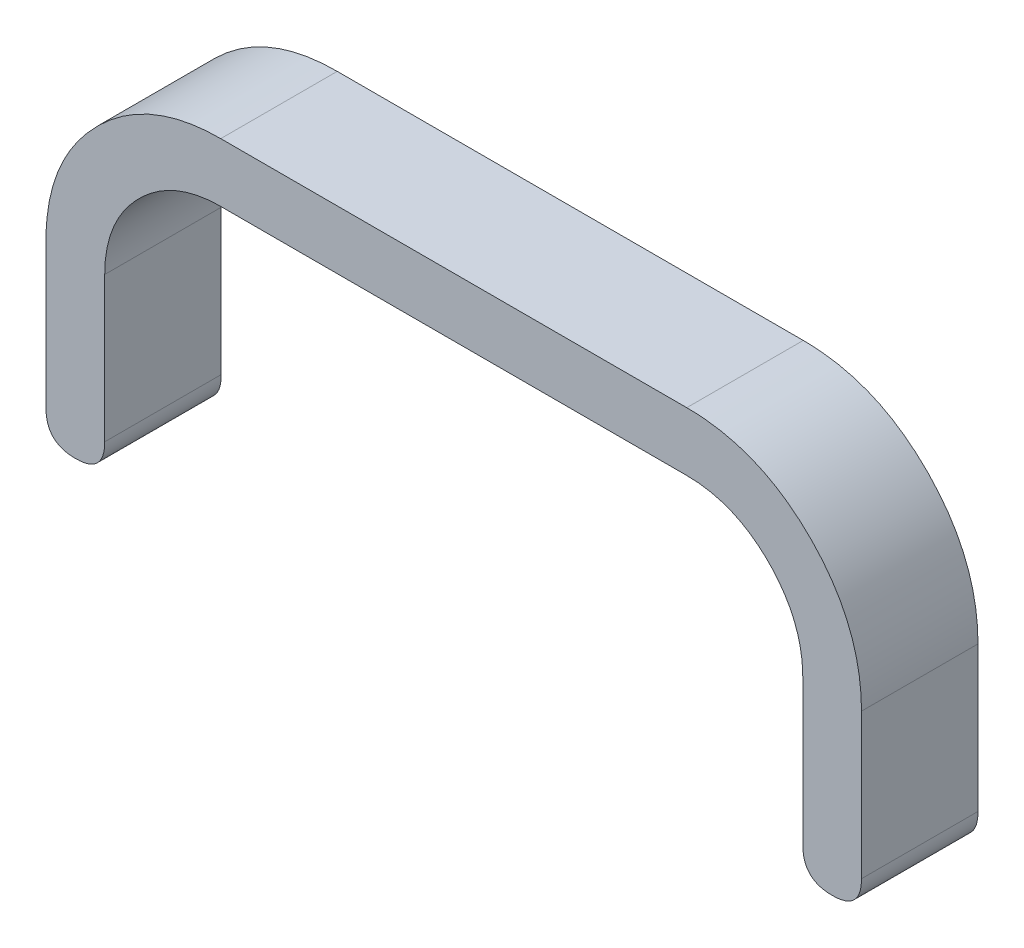
ISO-10303-21;
HEADER;
FILE_DESCRIPTION(('STEP AP214'),'2;1');
FILE_NAME('part.step','',(''),(''),'','','');
FILE_SCHEMA(('AUTOMOTIVE_DESIGN { 1 0 10303 214 1 1 1 1 }'));
ENDSEC;
DATA;
#1=APPLICATION_CONTEXT('core data for automotive mechanical design processes');
#2=APPLICATION_PROTOCOL_DEFINITION('international standard','automotive_design',2000,#1);
#3=PRODUCT_CONTEXT('',#1,'mechanical');
#4=PRODUCT('Part','Part','',(#3));
#5=PRODUCT_RELATED_PRODUCT_CATEGORY('part','',(#4));
#6=PRODUCT_DEFINITION_FORMATION('','',#4);
#7=PRODUCT_DEFINITION_CONTEXT('part definition',#1,'design');
#8=PRODUCT_DEFINITION('design','',#6,#7);
#9=PRODUCT_DEFINITION_SHAPE('','',#8);
#10=(LENGTH_UNIT() NAMED_UNIT(*) SI_UNIT(.MILLI.,.METRE.));
#11=(NAMED_UNIT(*) PLANE_ANGLE_UNIT() SI_UNIT($,.RADIAN.));
#12=(NAMED_UNIT(*) SI_UNIT($,.STERADIAN.) SOLID_ANGLE_UNIT());
#13=UNCERTAINTY_MEASURE_WITH_UNIT(LENGTH_MEASURE(1.E-05),#10,'distance_accuracy_value','');
#14=(GEOMETRIC_REPRESENTATION_CONTEXT(3) GLOBAL_UNCERTAINTY_ASSIGNED_CONTEXT((#13)) GLOBAL_UNIT_ASSIGNED_CONTEXT((#10,
#11,#12)) REPRESENTATION_CONTEXT('',''));
#15=CARTESIAN_POINT('',(0.,0.,0.));
#16=DIRECTION('',(0.,0.,1.));
#17=DIRECTION('',(1.,0.,0.));
#18=AXIS2_PLACEMENT_3D('',#15,#16,#17);
#19=CARTESIAN_POINT('',(0.,0.,0.));
#20=DIRECTION('',(0.,0.,1.));
#21=DIRECTION('',(1.,0.,0.));
#22=AXIS2_PLACEMENT_3D('',#19,#20,#21);
#23=PLANE('',#22);
#24=DIRECTION('',(0.,1.,0.));
#25=VECTOR('',#24,1.);
#26=CARTESIAN_POINT('',(2.7496,-20.3407175,0.));
#27=LINE('',#26,#25);
#28=CARTESIAN_POINT('',(2.7496,-20.4651075,0.));
#29=VERTEX_POINT('',#28);
#30=CARTESIAN_POINT('',(2.7496,-20.3407175,0.));
#31=VERTEX_POINT('',#30);
#32=EDGE_CURVE('E152',#29,#31,#27,.T.);
#33=ORIENTED_EDGE('',*,*,#32,.F.);
#34=CARTESIAN_POINT('',(2.7496,-20.4651075,0.));
#35=CARTESIAN_POINT('',(2.74960807870909,-20.467144578321,0.));
#36=CARTESIAN_POINT('',(2.74972821820761,-20.469212540125,0.));
#37=CARTESIAN_POINT('',(2.75035161883358,-20.4733290778557,0.));
#38=CARTESIAN_POINT('',(2.75086287535263,-20.4753763339155,0.));
#39=CARTESIAN_POINT('',(2.7524472053789,-20.4792910350747,0.));
#40=CARTESIAN_POINT('',(2.75352511881247,-20.4811567644396,0.));
#41=CARTESIAN_POINT('',(2.75629255072107,-20.4843845101896,0.));
#42=CARTESIAN_POINT('',(2.75798432078312,-20.4857446343754,0.));
#43=CARTESIAN_POINT('',(2.76210824248871,-20.4880848112958,0.));
#44=CARTESIAN_POINT('',(2.76462124834612,-20.488907254779,0.));
#45=CARTESIAN_POINT('',(2.76972255474357,-20.4898938254692,0.));
#46=CARTESIAN_POINT('',(2.77230750686315,-20.4900735730136,0.));
#47=CARTESIAN_POINT('',(2.7748,-20.49008,0.));
#48=B_SPLINE_CURVE_WITH_KNOTS('',3,(#34,#35,#36,#37,#38,#39,#40,#41,#42,#43,#44,#45,#46,#47),
.UNSPECIFIED.,.F.,.F.,(4,2,2,2,2,2,4),(0.,0.00615741816168192,0.0124441880141881,
0.0187855483379579,0.0251504074660603,0.0329680336586619,0.0405943144542345),.UNSPECIFIED.);
#49=CARTESIAN_POINT('',(2.7748,-20.49008,0.));
#50=VERTEX_POINT('',#49);
#51=EDGE_CURVE('E269',#29,#50,#48,.T.);
#52=ORIENTED_EDGE('',*,*,#51,.T.);
#53=CARTESIAN_POINT('',(2.7748,-20.49008,0.));
#54=CARTESIAN_POINT('',(2.77689249082312,-20.4900711009627,0.));
#55=CARTESIAN_POINT('',(2.77901882228493,-20.489948007743,0.));
#56=CARTESIAN_POINT('',(2.78325225684113,-20.4893034042043,0.));
#57=CARTESIAN_POINT('',(2.78535791549197,-20.4887732152388,0.));
#58=CARTESIAN_POINT('',(2.78932411457904,-20.487144557943,0.));
#59=CARTESIAN_POINT('',(2.79118832601554,-20.4860562870533,0.));
#60=CARTESIAN_POINT('',(2.79440959926015,-20.4832687806146,0.));
#61=CARTESIAN_POINT('',(2.79576470062887,-20.4815672317718,0.));
#62=CARTESIAN_POINT('',(2.79808127374799,-20.4774330822669,0.));
#63=CARTESIAN_POINT('',(2.79888813295651,-20.474922058413,0.));
#64=CARTESIAN_POINT('',(2.79982499708085,-20.46993196635,0.));
#65=CARTESIAN_POINT('',(2.799994845539,-20.4674610524802,0.));
#66=CARTESIAN_POINT('',(2.8,-20.4650725,0.));
#67=B_SPLINE_CURVE_WITH_KNOTS('',3,(#53,#54,#55,#56,#57,#58,#59,#60,#61,#62,#63,#64,#65,#66),
.UNSPECIFIED.,.F.,.F.,(4,2,2,2,2,2,4),(0.,0.00632865589769137,0.0127961082036602,
0.019149386352187,0.0255268843609778,0.0333230170829302,0.0406225102328526),.UNSPECIFIED.);
#68=CARTESIAN_POINT('',(2.8,-20.4650725,0.));
#69=VERTEX_POINT('',#68);
#70=EDGE_CURVE('E262',#50,#69,#67,.T.);
#71=ORIENTED_EDGE('',*,*,#70,.T.);
#72=DIRECTION('',(0.,1.,0.));
#73=VECTOR('',#72,1.);
#74=CARTESIAN_POINT('',(2.8,-20.4650725,0.));
#75=LINE('',#74,#73);
#76=CARTESIAN_POINT('',(2.8,-20.3405075,0.));
#77=VERTEX_POINT('',#76);
#78=EDGE_CURVE('E123',#77,#69,#75,.F.);
#79=ORIENTED_EDGE('',*,*,#78,.F.);
#80=CARTESIAN_POINT('',(2.8,-20.3405075,0.));
#81=CARTESIAN_POINT('',(2.80002347245347,-20.3320217202953,0.));
#82=CARTESIAN_POINT('',(2.79939850743918,-20.3235098149267,0.));
#83=CARTESIAN_POINT('',(2.79676662552694,-20.3067536514176,0.));
#84=CARTESIAN_POINT('',(2.7947672254067,-20.2985081916382,0.));
#85=CARTESIAN_POINT('',(2.78921797084564,-20.2822560136484,0.));
#86=CARTESIAN_POINT('',(2.78562147952115,-20.2742648812623,0.));
#87=CARTESIAN_POINT('',(2.7770112790827,-20.2590803276584,0.));
#88=CARTESIAN_POINT('',(2.7719952070086,-20.2518882645637,0.));
#89=CARTESIAN_POINT('',(2.76127873269534,-20.2389063600848,0.));
#90=CARTESIAN_POINT('',(2.75565430063458,-20.2330526633238,0.));
#91=CARTESIAN_POINT('',(2.74362209917352,-20.2222199581196,0.));
#92=CARTESIAN_POINT('',(2.73721520118955,-20.2172399914185,0.));
#93=CARTESIAN_POINT('',(2.72285146449312,-20.2079200467368,0.));
#94=CARTESIAN_POINT('',(2.7148010398298,-20.2037214329533,0.));
#95=CARTESIAN_POINT('',(2.69802894082252,-20.1969874171256,0.));
#96=CARTESIAN_POINT('',(2.68930706083362,-20.1944525269083,0.));
#97=CARTESIAN_POINT('',(2.6754216870949,-20.1917705993874,0.));
#98=CARTESIAN_POINT('',(2.67035671800322,-20.1910646935576,0.));
#99=CARTESIAN_POINT('',(2.66019643313504,-20.1901397964624,0.));
#100=CARTESIAN_POINT('',(2.65510124584216,-20.1899194162579,0.));
#101=CARTESIAN_POINT('',(2.6500075,-20.18992,0.));
#102=B_SPLINE_CURVE_WITH_KNOTS('',3,(#80,#81,#82,#83,#84,#85,#86,#87,#88,#89,#90,#91,#92,#93,
#94,#95,#96,#97,#98,#99,#100,#101),.UNSPECIFIED.,.F.,.F.,(4,2,2,2,2,2,2,2,2,2,4),(0.,
0.0254711021853363,0.0508039998777647,0.0769309985183244,0.103101745206667,0.127375288651194,
0.151622041523846,0.17868297156612,0.205752222717763,0.221073109481131,0.236350110687773),.UNSPECIFIED.);
#103=CARTESIAN_POINT('',(2.6500075,-20.18992,0.));
#104=VERTEX_POINT('',#103);
#105=EDGE_CURVE('E24',#77,#104,#102,.T.);
#106=ORIENTED_EDGE('',*,*,#105,.T.);
#107=DIRECTION('',(1.,0.,0.));
#108=VECTOR('',#107,1.);
#109=CARTESIAN_POINT('',(2.6500075,-20.18992,0.));
#110=LINE('',#109,#108);
#111=CARTESIAN_POINT('',(2.2499925,-20.18992,0.));
#112=VERTEX_POINT('',#111);
#113=EDGE_CURVE('E128',#112,#104,#110,.T.);
#114=ORIENTED_EDGE('',*,*,#113,.F.);
#115=CARTESIAN_POINT('',(2.2499925,-20.18992,0.));
#116=CARTESIAN_POINT('',(2.24150404708559,-20.189895741139,0.));
#117=CARTESIAN_POINT('',(2.23298836338036,-20.1905265430491,0.));
#118=CARTESIAN_POINT('',(2.21623002439109,-20.1931844162875,0.));
#119=CARTESIAN_POINT('',(2.20798612080651,-20.195203755814,0.));
#120=CARTESIAN_POINT('',(2.19183005145181,-20.2007808490056,0.));
#121=CARTESIAN_POINT('',(2.18392856942392,-20.2043701936911,0.));
#122=CARTESIAN_POINT('',(2.16892087909701,-20.2129485100859,0.));
#123=CARTESIAN_POINT('',(2.1618159079179,-20.2179396179648,0.));
#124=CARTESIAN_POINT('',(2.14900245858002,-20.2285937167868,0.));
#125=CARTESIAN_POINT('',(2.14322990451648,-20.2341810848491,0.));
#126=CARTESIAN_POINT('',(2.1325341600748,-20.2461138985911,0.));
#127=CARTESIAN_POINT('',(2.12761023904276,-20.2524586841028,0.));
#128=CARTESIAN_POINT('',(2.11829685247503,-20.2667768579616,0.));
#129=CARTESIAN_POINT('',(2.11406458301313,-20.274854647397,0.));
#130=CARTESIAN_POINT('',(2.10725964115796,-20.2916838471437,0.));
#131=CARTESIAN_POINT('',(2.10468729813588,-20.3004353907595,0.));
#132=CARTESIAN_POINT('',(2.10192824866457,-20.3144728455269,0.));
#133=CARTESIAN_POINT('',(2.10119274214425,-20.3196598899884,0.));
#134=CARTESIAN_POINT('',(2.10022890363213,-20.3300677834004,0.));
#135=CARTESIAN_POINT('',(2.09999923338375,-20.3352885064149,0.));
#136=CARTESIAN_POINT('',(2.1,-20.3405075,0.));
#137=B_SPLINE_CURVE_WITH_KNOTS('',3,(#115,#116,#117,#118,#119,#120,#121,#122,#123,#124,#125,
#126,#127,#128,#129,#130,#131,#132,#133,#134,#135,#136),.UNSPECIFIED.,.F.,.F.,(4,2,2,2,2,2,2,2,
2,2,4),(0.,0.0254804082047982,0.0508200706054709,0.0766949145066699,0.10260940547549,
0.126632549326425,0.150634905330637,0.177816726912359,0.205003940394527,0.220698393364785,
0.236351274459153),.UNSPECIFIED.);
#138=CARTESIAN_POINT('',(2.1,-20.3405075,0.));
#139=VERTEX_POINT('',#138);
#140=EDGE_CURVE('E146',#112,#139,#137,.T.);
#141=ORIENTED_EDGE('',*,*,#140,.T.);
#142=DIRECTION('',(0.,1.,0.));
#143=VECTOR('',#142,1.);
#144=CARTESIAN_POINT('',(2.1,-20.3405075,0.));
#145=LINE('',#144,#143);
#146=CARTESIAN_POINT('',(2.1,-20.4650725,0.));
#147=VERTEX_POINT('',#146);
#148=EDGE_CURVE('E164',#147,#139,#145,.T.);
#149=ORIENTED_EDGE('',*,*,#148,.F.);
#150=CARTESIAN_POINT('',(2.1,-20.4650725,0.));
#151=CARTESIAN_POINT('',(2.10000814940635,-20.4671154799164,0.));
#152=CARTESIAN_POINT('',(2.10012861312222,-20.4691896005673,0.));
#153=CARTESIAN_POINT('',(2.10075416525257,-20.4733184530926,0.));
#154=CARTESIAN_POINT('',(2.10126730910898,-20.4753718542771,0.));
#155=CARTESIAN_POINT('',(2.10285631262184,-20.4792933800596,0.));
#156=CARTESIAN_POINT('',(2.10393579033859,-20.4811602204295,0.));
#157=CARTESIAN_POINT('',(2.10670670524853,-20.4843895734181,0.));
#158=CARTESIAN_POINT('',(2.10840040081975,-20.4857501868259,0.));
#159=CARTESIAN_POINT('',(2.11252786982429,-20.4880899416791,0.));
#160=CARTESIAN_POINT('',(2.11504234385639,-20.4889116265335,0.));
#161=CARTESIAN_POINT('',(2.12013761228872,-20.4898946450458,0.));
#162=CARTESIAN_POINT('',(2.12271462573813,-20.4900736834129,0.));
#163=CARTESIAN_POINT('',(2.1252,-20.49008,0.));
#164=B_SPLINE_CURVE_WITH_KNOTS('',3,(#150,#151,#152,#153,#154,#155,#156,#157,#158,#159,#160,
#161,#162,#163),.UNSPECIFIED.,.F.,.F.,(4,2,2,2,2,2,4),(0.,0.00617555295361225,
0.0124813041899314,0.018827839685845,0.0251979509500648,0.0330188630002424,0.040622583008629),.UNSPECIFIED.);
#165=CARTESIAN_POINT('',(2.1252,-20.49008,0.));
#166=VERTEX_POINT('',#165);
#167=EDGE_CURVE('E250',#147,#166,#164,.T.);
#168=ORIENTED_EDGE('',*,*,#167,.T.);
#169=CARTESIAN_POINT('',(2.1252,-20.49008,0.));
#170=CARTESIAN_POINT('',(2.12729559112084,-20.4900710352382,0.));
#171=CARTESIAN_POINT('',(2.12942525688445,-20.4899477882629,0.));
#172=CARTESIAN_POINT('',(2.13366539232826,-20.4893018722382,0.));
#173=CARTESIAN_POINT('',(2.13577440768665,-20.4887704711943,0.));
#174=CARTESIAN_POINT('',(2.13974190435177,-20.4871392765701,0.));
#175=CARTESIAN_POINT('',(2.14160452667354,-20.4860509711266,0.));
#176=CARTESIAN_POINT('',(2.14482272322683,-20.4832639308902,0.));
#177=CARTESIAN_POINT('',(2.14617633290092,-20.4815628796141,0.));
#178=CARTESIAN_POINT('',(2.14848911306052,-20.4774310621813,0.));
#179=CARTESIAN_POINT('',(2.14929403520258,-20.474922133203,0.));
#180=CARTESIAN_POINT('',(2.15022605950084,-20.4699451267066,0.));
#181=CARTESIAN_POINT('',(2.15039494677754,-20.4674855666812,0.));
#182=CARTESIAN_POINT('',(2.1504,-20.4651075,0.));
#183=B_SPLINE_CURVE_WITH_KNOTS('',3,(#169,#170,#171,#172,#173,#174,#175,#176,#177,#178,#179,
#180,#181,#182),.UNSPECIFIED.,.F.,.F.,(4,2,2,2,2,2,4),(0.,0.00633835841973599,0.01281623087059,
0.0191655597386061,0.0255391485675933,0.0333274919146962,0.0405942283673216),.UNSPECIFIED.);
#184=CARTESIAN_POINT('',(2.1504,-20.4651075,0.));
#185=VERTEX_POINT('',#184);
#186=EDGE_CURVE('E163',#166,#185,#183,.T.);
#187=ORIENTED_EDGE('',*,*,#186,.T.);
#188=DIRECTION('',(0.,1.,0.));
#189=VECTOR('',#188,1.);
#190=CARTESIAN_POINT('',(2.1504,-20.4651075,0.));
#191=LINE('',#190,#189);
#192=CARTESIAN_POINT('',(2.1504,-20.3407175,0.));
#193=VERTEX_POINT('',#192);
#194=EDGE_CURVE('E160',#193,#185,#191,.F.);
#195=ORIENTED_EDGE('',*,*,#194,.F.);
#196=CARTESIAN_POINT('',(2.1504,-20.3407175,0.));
#197=CARTESIAN_POINT('',(2.15038419090499,-20.3351146994841,0.));
#198=CARTESIAN_POINT('',(2.15079840304606,-20.3294955033454,0.));
#199=CARTESIAN_POINT('',(2.15253650003459,-20.3184349901666,0.));
#200=CARTESIAN_POINT('',(2.15385516055024,-20.3129928385838,0.));
#201=CARTESIAN_POINT('',(2.15746110040773,-20.3023973418052,0.));
#202=CARTESIAN_POINT('',(2.15975410555372,-20.2972459110897,0.));
#203=CARTESIAN_POINT('',(2.16522169443857,-20.2874294081864,0.));
#204=CARTESIAN_POINT('',(2.16839775696199,-20.2827651700437,0.));
#205=CARTESIAN_POINT('',(2.1753001194857,-20.2741682393562,0.));
#206=CARTESIAN_POINT('',(2.17900021947354,-20.2702141524113,0.));
#207=CARTESIAN_POINT('',(2.18692060688149,-20.2628689266225,0.));
#208=CARTESIAN_POINT('',(2.19114047881192,-20.2594773431549,0.));
#209=CARTESIAN_POINT('',(2.20067631088905,-20.2530544121251,0.));
#210=CARTESIAN_POINT('',(2.20606344541421,-20.2501263604449,0.));
#211=CARTESIAN_POINT('',(2.21731554925429,-20.2454059380596,0.));
#212=CARTESIAN_POINT('',(2.22318050756016,-20.2436135411974,0.));
#213=CARTESIAN_POINT('',(2.23262924341519,-20.2416794594875,0.));
#214=CARTESIAN_POINT('',(2.23614212948037,-20.2411609706121,0.));
#215=CARTESIAN_POINT('',(2.243194687602,-20.2404813077041,0.));
#216=CARTESIAN_POINT('',(2.24673427935522,-20.2403193136625,0.));
#217=CARTESIAN_POINT('',(2.2502725,-20.24032,0.));
#218=B_SPLINE_CURVE_WITH_KNOTS('',3,(#196,#197,#198,#199,#200,#201,#202,#203,#204,#205,#206,
#207,#208,#209,#210,#211,#212,#213,#214,#215,#216,#217),.UNSPECIFIED.,.F.,.F.,(4,2,2,2,2,2,2,2,
2,2,4),(0.,0.0168161592715581,0.0335359930770567,0.0503554714223923,0.0672032874124351,
0.0833959404834371,0.0995757326428344,0.117847771018597,0.136119388526332,0.146755727970553,
0.157367576036084),.UNSPECIFIED.);
#219=CARTESIAN_POINT('',(2.2502725,-20.24032,0.));
#220=VERTEX_POINT('',#219);
#221=EDGE_CURVE('E159',#193,#220,#218,.T.);
#222=ORIENTED_EDGE('',*,*,#221,.T.);
#223=DIRECTION('',(1.,0.,0.));
#224=VECTOR('',#223,1.);
#225=CARTESIAN_POINT('',(2.2502725,-20.24032,0.));
#226=LINE('',#225,#224);
#227=CARTESIAN_POINT('',(2.6497275,-20.24032,0.));
#228=VERTEX_POINT('',#227);
#229=EDGE_CURVE('E156',#228,#220,#226,.F.);
#230=ORIENTED_EDGE('',*,*,#229,.F.);
#231=CARTESIAN_POINT('',(2.6497275,-20.24032,0.));
#232=CARTESIAN_POINT('',(2.65525632027436,-20.2403047276785,0.));
#233=CARTESIAN_POINT('',(2.66080181263927,-20.2407115069295,0.));
#234=CARTESIAN_POINT('',(2.6717203535863,-20.2424212128108,0.));
#235=CARTESIAN_POINT('',(2.67709416016376,-20.2437193798898,0.));
#236=CARTESIAN_POINT('',(2.68755767553323,-20.2472733819885,0.));
#237=CARTESIAN_POINT('',(2.69264545124568,-20.2495350108111,0.));
#238=CARTESIAN_POINT('',(2.70233877312393,-20.2549301187693,0.));
#239=CARTESIAN_POINT('',(2.70694366316865,-20.2580647635164,0.));
#240=CARTESIAN_POINT('',(2.71540885654263,-20.2648721989559,0.));
#241=CARTESIAN_POINT('',(2.71929244055137,-20.268516562587,0.));
#242=CARTESIAN_POINT('',(2.72652467534636,-20.2763016063643,0.));
#243=CARTESIAN_POINT('',(2.72987350510711,-20.2804421196408,0.));
#244=CARTESIAN_POINT('',(2.7363277110403,-20.2898954208589,0.));
#245=CARTESIAN_POINT('',(2.73931543366999,-20.2952904815276,0.));
#246=CARTESIAN_POINT('',(2.7441624001479,-20.3065658723933,0.));
#247=CARTESIAN_POINT('',(2.74602196852189,-20.3124460624842,0.));
#248=CARTESIAN_POINT('',(2.74809652195806,-20.3221009435302,0.));
#249=CARTESIAN_POINT('',(2.74866991236434,-20.3258041989531,0.));
#250=CARTESIAN_POINT('',(2.74942188095505,-20.3332448391632,0.));
#251=CARTESIAN_POINT('',(2.74960113070034,-20.3369821549859,0.));
#252=CARTESIAN_POINT('',(2.7496,-20.3407175,0.));
#253=B_SPLINE_CURVE_WITH_KNOTS('',3,(#231,#232,#233,#234,#235,#236,#237,#238,#239,#240,#241,
#242,#243,#244,#245,#246,#247,#248,#249,#250,#251,#252),.UNSPECIFIED.,.F.,.F.,(4,2,2,2,2,2,2,2,
2,2,4),(0.,0.0165951248365384,0.0331023223477367,0.049710219604979,0.0663403981674403,
0.0822659881261889,0.0981862367986119,0.116567440984085,0.134943355107242,0.14616599304673,
0.157369494306616),.UNSPECIFIED.);
#254=EDGE_CURVE('E155',#228,#31,#253,.T.);
#255=ORIENTED_EDGE('',*,*,#254,.T.);
#256=EDGE_LOOP('',(#33,#52,#71,#79,#106,#114,#141,#149,#168,#187,#195,#222,#230,#255));
#257=FACE_BOUND('',#256,.T.);
#258=ADVANCED_FACE('F17',(#257),#23,.T.);
#259=CARTESIAN_POINT('',(2.8,-20.4650725,-0.1));
#260=DIRECTION('',(1.,0.,0.));
#261=DIRECTION('',(0.,0.,-1.));
#262=AXIS2_PLACEMENT_3D('',#259,#260,#261);
#263=PLANE('',#262);
#264=DIRECTION('',(0.,1.,0.));
#265=VECTOR('',#264,1.);
#266=CARTESIAN_POINT('',(2.8,0.,-0.1));
#267=LINE('',#266,#265);
#268=CARTESIAN_POINT('',(2.8,-20.4650725,-0.1));
#269=VERTEX_POINT('',#268);
#270=CARTESIAN_POINT('',(2.8,-20.3405075,-0.1));
#271=VERTEX_POINT('',#270);
#272=EDGE_CURVE('E369',#269,#271,#267,.T.);
#273=ORIENTED_EDGE('',*,*,#272,.T.);
#274=DIRECTION('',(0.,0.,1.));
#275=VECTOR('',#274,1.);
#276=CARTESIAN_POINT('',(2.8,-20.3405075,-0.05));
#277=LINE('',#276,#275);
#278=EDGE_CURVE('E140',#271,#77,#277,.T.);
#279=ORIENTED_EDGE('',*,*,#278,.T.);
#280=ORIENTED_EDGE('',*,*,#78,.T.);
#281=DIRECTION('',(0.,0.,-1.));
#282=VECTOR('',#281,1.);
#283=CARTESIAN_POINT('',(2.8,-20.4650725,-0.05));
#284=LINE('',#283,#282);
#285=EDGE_CURVE('E372',#69,#269,#284,.T.);
#286=ORIENTED_EDGE('',*,*,#285,.T.);
#287=EDGE_LOOP('',(#273,#279,#280,#286));
#288=FACE_BOUND('',#287,.T.);
#289=ADVANCED_FACE('F258',(#288),#263,.T.);
#290=CARTESIAN_POINT('',(2.8,-20.3405075,-0.1));
#291=CARTESIAN_POINT('',(2.8,-20.2779625,-0.1));
#292=CARTESIAN_POINT('',(2.7125,-20.18992,-0.1));
#293=CARTESIAN_POINT('',(2.6500075,-20.18992,-0.1));
#294=CARTESIAN_POINT('',(2.8,-20.3405075,0.));
#295=CARTESIAN_POINT('',(2.8,-20.2779625,0.));
#296=CARTESIAN_POINT('',(2.7125,-20.18992,0.));
#297=CARTESIAN_POINT('',(2.6500075,-20.18992,0.));
#298=B_SPLINE_SURFACE_WITH_KNOTS('',1,2,((#290,#291,#292,#293),(#294,#295,#296,#297)),
.UNSPECIFIED.,.F.,.F.,.F.,(2,2),(3,1,3),(0.,1.),(0.,0.5,1.),.UNSPECIFIED.);
#299=CARTESIAN_POINT('',(2.8,-20.3405075,-0.1));
#300=CARTESIAN_POINT('',(2.80002347245347,-20.3320217202953,-0.1));
#301=CARTESIAN_POINT('',(2.79939850743918,-20.3235098149267,-0.1));
#302=CARTESIAN_POINT('',(2.79676662552694,-20.3067536514176,-0.1));
#303=CARTESIAN_POINT('',(2.7947672254067,-20.2985081916382,-0.1));
#304=CARTESIAN_POINT('',(2.78921797084564,-20.2822560136484,-0.1));
#305=CARTESIAN_POINT('',(2.78562147952115,-20.2742648812623,-0.1));
#306=CARTESIAN_POINT('',(2.7770112790827,-20.2590803276584,-0.1));
#307=CARTESIAN_POINT('',(2.7719952070086,-20.2518882645637,-0.1));
#308=CARTESIAN_POINT('',(2.76127873269534,-20.2389063600848,-0.1));
#309=CARTESIAN_POINT('',(2.75565430063458,-20.2330526633238,-0.1));
#310=CARTESIAN_POINT('',(2.74362209917352,-20.2222199581196,-0.1));
#311=CARTESIAN_POINT('',(2.73721520118955,-20.2172399914185,-0.1));
#312=CARTESIAN_POINT('',(2.72285146449312,-20.2079200467368,-0.1));
#313=CARTESIAN_POINT('',(2.7148010398298,-20.2037214329533,-0.1));
#314=CARTESIAN_POINT('',(2.69802894082252,-20.1969874171256,-0.1));
#315=CARTESIAN_POINT('',(2.68930706083362,-20.1944525269083,-0.1));
#316=CARTESIAN_POINT('',(2.6754216870949,-20.1917705993874,-0.1));
#317=CARTESIAN_POINT('',(2.67035671800322,-20.1910646935576,-0.1));
#318=CARTESIAN_POINT('',(2.66019643313504,-20.1901397964624,-0.1));
#319=CARTESIAN_POINT('',(2.65510124584216,-20.1899194162579,-0.1));
#320=CARTESIAN_POINT('',(2.6500075,-20.18992,-0.1));
#321=B_SPLINE_CURVE_WITH_KNOTS('',3,(#299,#300,#301,#302,#303,#304,#305,#306,#307,#308,#309,
#310,#311,#312,#313,#314,#315,#316,#317,#318,#319,#320),.UNSPECIFIED.,.F.,.F.,(4,2,2,2,2,2,2,2,
2,2,4),(0.,0.0254711021853363,0.0508039998777646,0.0769309985183242,0.103101745206667,
0.127375288651194,0.151622041523846,0.178682971566121,0.205752222717764,0.221073109481131,
0.236350110687773),.UNSPECIFIED.);
#322=CARTESIAN_POINT('',(2.6500075,-20.18992,-0.1));
#323=VERTEX_POINT('',#322);
#324=EDGE_CURVE('E144',#271,#323,#321,.T.);
#325=DIRECTION('',(0.,0.,1.));
#326=VECTOR('',#325,1.);
#327=CARTESIAN_POINT('',(2.6500075,-20.18992,-0.1));
#328=LINE('',#327,#326);
#329=EDGE_CURVE('E132',#104,#323,#328,.F.);
#330=ORIENTED_EDGE('',*,*,#278,.F.);
#331=ORIENTED_EDGE('',*,*,#324,.T.);
#332=ORIENTED_EDGE('',*,*,#329,.F.);
#333=ORIENTED_EDGE('',*,*,#105,.F.);
#334=EDGE_LOOP('',(#330,#331,#332,#333));
#335=FACE_BOUND('',#334,.T.);
#336=ADVANCED_FACE('F142',(#335),#298,.F.);
#337=CARTESIAN_POINT('',(2.6500075,-20.18992,-0.1));
#338=DIRECTION('',(0.,1.,0.));
#339=DIRECTION('',(0.,0.,1.));
#340=AXIS2_PLACEMENT_3D('',#337,#338,#339);
#341=PLANE('',#340);
#342=DIRECTION('',(1.,0.,0.));
#343=VECTOR('',#342,1.);
#344=CARTESIAN_POINT('',(0.,-20.18992,-0.1));
#345=LINE('',#344,#343);
#346=CARTESIAN_POINT('',(2.2499925,-20.18992,-0.1));
#347=VERTEX_POINT('',#346);
#348=EDGE_CURVE('E221',#323,#347,#345,.F.);
#349=ORIENTED_EDGE('',*,*,#348,.T.);
#350=DIRECTION('',(0.,0.,1.));
#351=VECTOR('',#350,1.);
#352=CARTESIAN_POINT('',(2.2499925,-20.18992,-0.05));
#353=LINE('',#352,#351);
#354=EDGE_CURVE('E134',#347,#112,#353,.T.);
#355=ORIENTED_EDGE('',*,*,#354,.T.);
#356=ORIENTED_EDGE('',*,*,#113,.T.);
#357=ORIENTED_EDGE('',*,*,#329,.T.);
#358=EDGE_LOOP('',(#349,#355,#356,#357));
#359=FACE_BOUND('',#358,.T.);
#360=ADVANCED_FACE('F130',(#359),#341,.T.);
#361=CARTESIAN_POINT('',(2.2499925,-20.18992,-0.1));
#362=CARTESIAN_POINT('',(2.1875,-20.18992,-0.1));
#363=CARTESIAN_POINT('',(2.1,-20.2779625,-0.1));
#364=CARTESIAN_POINT('',(2.1,-20.3405075,-0.1));
#365=CARTESIAN_POINT('',(2.2499925,-20.18992,0.));
#366=CARTESIAN_POINT('',(2.1875,-20.18992,0.));
#367=CARTESIAN_POINT('',(2.1,-20.2779625,0.));
#368=CARTESIAN_POINT('',(2.1,-20.3405075,0.));
#369=B_SPLINE_SURFACE_WITH_KNOTS('',1,2,((#361,#362,#363,#364),(#365,#366,#367,#368)),
.UNSPECIFIED.,.F.,.F.,.F.,(2,2),(3,1,3),(0.,1.),(0.,0.5,1.),.UNSPECIFIED.);
#370=CARTESIAN_POINT('',(2.2499925,-20.18992,-0.1));
#371=CARTESIAN_POINT('',(2.24150404708559,-20.189895741139,-0.1));
#372=CARTESIAN_POINT('',(2.23298836338036,-20.1905265430491,-0.1));
#373=CARTESIAN_POINT('',(2.21623002439109,-20.1931844162875,-0.1));
#374=CARTESIAN_POINT('',(2.20798612080651,-20.195203755814,-0.1));
#375=CARTESIAN_POINT('',(2.19183005145181,-20.2007808490056,-0.1));
#376=CARTESIAN_POINT('',(2.18392856942392,-20.2043701936911,-0.1));
#377=CARTESIAN_POINT('',(2.16892087909701,-20.2129485100859,-0.1));
#378=CARTESIAN_POINT('',(2.1618159079179,-20.2179396179648,-0.1));
#379=CARTESIAN_POINT('',(2.14900245858002,-20.2285937167868,-0.1));
#380=CARTESIAN_POINT('',(2.14322990451647,-20.2341810848491,-0.1));
#381=CARTESIAN_POINT('',(2.1325341600748,-20.2461138985911,-0.1));
#382=CARTESIAN_POINT('',(2.12761023904276,-20.2524586841028,-0.1));
#383=CARTESIAN_POINT('',(2.11829685247503,-20.2667768579616,-0.1));
#384=CARTESIAN_POINT('',(2.11406458301313,-20.274854647397,-0.1));
#385=CARTESIAN_POINT('',(2.10725964115796,-20.2916838471437,-0.1));
#386=CARTESIAN_POINT('',(2.10468729813588,-20.3004353907595,-0.1));
#387=CARTESIAN_POINT('',(2.10192824866457,-20.3144728455269,-0.1));
#388=CARTESIAN_POINT('',(2.10119274214425,-20.3196598899884,-0.1));
#389=CARTESIAN_POINT('',(2.10022890363213,-20.3300677834004,-0.1));
#390=CARTESIAN_POINT('',(2.09999923338375,-20.3352885064149,-0.1));
#391=CARTESIAN_POINT('',(2.1,-20.3405075,-0.1));
#392=B_SPLINE_CURVE_WITH_KNOTS('',3,(#370,#371,#372,#373,#374,#375,#376,#377,#378,#379,#380,
#381,#382,#383,#384,#385,#386,#387,#388,#389,#390,#391),.UNSPECIFIED.,.F.,.F.,(4,2,2,2,2,2,2,2,
2,2,4),(0.,0.025480408204798,0.0508200706054703,0.0766949145066697,0.102609405475489,
0.126632549326426,0.150634905330637,0.177816726912359,0.205003940394527,0.220698393364785,
0.236351274459152),.UNSPECIFIED.);
#393=CARTESIAN_POINT('',(2.1,-20.3405075,-0.1));
#394=VERTEX_POINT('',#393);
#395=EDGE_CURVE('E214',#347,#394,#392,.T.);
#396=DIRECTION('',(0.,0.,1.));
#397=VECTOR('',#396,1.);
#398=CARTESIAN_POINT('',(2.1,-20.3405075,-0.1));
#399=LINE('',#398,#397);
#400=EDGE_CURVE('E165',#139,#394,#399,.F.);
#401=ORIENTED_EDGE('',*,*,#354,.F.);
#402=ORIENTED_EDGE('',*,*,#395,.T.);
#403=ORIENTED_EDGE('',*,*,#400,.F.);
#404=ORIENTED_EDGE('',*,*,#140,.F.);
#405=EDGE_LOOP('',(#401,#402,#403,#404));
#406=FACE_BOUND('',#405,.T.);
#407=ADVANCED_FACE('F226',(#406),#369,.F.);
#408=CARTESIAN_POINT('',(2.1,-20.3405075,-0.1));
#409=DIRECTION('',(-1.,0.,0.));
#410=DIRECTION('',(0.,0.,1.));
#411=AXIS2_PLACEMENT_3D('',#408,#409,#410);
#412=PLANE('',#411);
#413=DIRECTION('',(0.,1.,0.));
#414=VECTOR('',#413,1.);
#415=CARTESIAN_POINT('',(2.1,0.,-0.1));
#416=LINE('',#415,#414);
#417=CARTESIAN_POINT('',(2.1,-20.4650725,-0.1));
#418=VERTEX_POINT('',#417);
#419=EDGE_CURVE('E220',#394,#418,#416,.F.);
#420=ORIENTED_EDGE('',*,*,#419,.T.);
#421=DIRECTION('',(0.,0.,1.));
#422=VECTOR('',#421,1.);
#423=CARTESIAN_POINT('',(2.1,-20.4650725,-0.05));
#424=LINE('',#423,#422);
#425=EDGE_CURVE('E387',#418,#147,#424,.T.);
#426=ORIENTED_EDGE('',*,*,#425,.T.);
#427=ORIENTED_EDGE('',*,*,#148,.T.);
#428=ORIENTED_EDGE('',*,*,#400,.T.);
#429=EDGE_LOOP('',(#420,#426,#427,#428));
#430=FACE_BOUND('',#429,.T.);
#431=ADVANCED_FACE('F231',(#430),#412,.T.);
#432=CARTESIAN_POINT('',(2.1,-20.4650725,-0.1));
#433=CARTESIAN_POINT('',(2.1,-20.49008,-0.1));
#434=CARTESIAN_POINT('',(2.1252,-20.49008,-0.1));
#435=CARTESIAN_POINT('',(2.1,-20.4650725,0.));
#436=CARTESIAN_POINT('',(2.1,-20.49008,0.));
#437=CARTESIAN_POINT('',(2.1252,-20.49008,0.));
#438=B_SPLINE_SURFACE_WITH_KNOTS('',1,2,((#432,#433,#434),(#435,#436,#437)),.UNSPECIFIED.,.F.,
.F.,.F.,(2,2),(3,3),(0.,1.),(0.,1.),.UNSPECIFIED.);
#439=CARTESIAN_POINT('',(2.1,-20.4650725,-0.1));
#440=CARTESIAN_POINT('',(2.10000814940635,-20.4671154799164,-0.1));
#441=CARTESIAN_POINT('',(2.10012861312222,-20.4691896005673,-0.1));
#442=CARTESIAN_POINT('',(2.10075416525257,-20.4733184530926,-0.1));
#443=CARTESIAN_POINT('',(2.10126730910898,-20.4753718542771,-0.1));
#444=CARTESIAN_POINT('',(2.10285631262184,-20.4792933800596,-0.1));
#445=CARTESIAN_POINT('',(2.10393579033859,-20.4811602204295,-0.1));
#446=CARTESIAN_POINT('',(2.10670670524853,-20.4843895734181,-0.1));
#447=CARTESIAN_POINT('',(2.10840040081975,-20.4857501868259,-0.1));
#448=CARTESIAN_POINT('',(2.11252786982429,-20.4880899416791,-0.1));
#449=CARTESIAN_POINT('',(2.11504234385639,-20.4889116265335,-0.1));
#450=CARTESIAN_POINT('',(2.12013761228872,-20.4898946450458,-0.1));
#451=CARTESIAN_POINT('',(2.12271462573813,-20.4900736834129,-0.1));
#452=CARTESIAN_POINT('',(2.1252,-20.49008,-0.1));
#453=B_SPLINE_CURVE_WITH_KNOTS('',3,(#439,#440,#441,#442,#443,#444,#445,#446,#447,#448,#449,
#450,#451,#452),.UNSPECIFIED.,.F.,.F.,(4,2,2,2,2,2,4),(0.,0.00617555295361222,
0.0124813041899315,0.0188278396858451,0.0251979509500648,0.0330188630002425,0.0406225830086291),.UNSPECIFIED.);
#454=CARTESIAN_POINT('',(2.1252,-20.49008,-0.1));
#455=VERTEX_POINT('',#454);
#456=EDGE_CURVE('E208',#418,#455,#453,.T.);
#457=DIRECTION('',(0.,0.,1.));
#458=VECTOR('',#457,1.);
#459=CARTESIAN_POINT('',(2.1252,-20.49008,-0.05));
#460=LINE('',#459,#458);
#461=EDGE_CURVE('E288',#455,#166,#460,.T.);
#462=ORIENTED_EDGE('',*,*,#425,.F.);
#463=ORIENTED_EDGE('',*,*,#456,.T.);
#464=ORIENTED_EDGE('',*,*,#461,.T.);
#465=ORIENTED_EDGE('',*,*,#167,.F.);
#466=EDGE_LOOP('',(#462,#463,#464,#465));
#467=FACE_BOUND('',#466,.T.);
#468=ADVANCED_FACE('F236',(#467),#438,.F.);
#469=CARTESIAN_POINT('',(2.1252,-20.49008,-0.1));
#470=CARTESIAN_POINT('',(2.1504,-20.49008,-0.1));
#471=CARTESIAN_POINT('',(2.1504,-20.4651075,-0.1));
#472=CARTESIAN_POINT('',(2.1252,-20.49008,0.));
#473=CARTESIAN_POINT('',(2.1504,-20.49008,0.));
#474=CARTESIAN_POINT('',(2.1504,-20.4651075,0.));
#475=B_SPLINE_SURFACE_WITH_KNOTS('',1,2,((#469,#470,#471),(#472,#473,#474)),.UNSPECIFIED.,.F.,
.F.,.F.,(2,2),(3,3),(0.,1.),(0.,1.),.UNSPECIFIED.);
#476=CARTESIAN_POINT('',(2.1252,-20.49008,-0.1));
#477=CARTESIAN_POINT('',(2.12729559112084,-20.4900710352382,-0.1));
#478=CARTESIAN_POINT('',(2.12942525688445,-20.4899477882629,-0.1));
#479=CARTESIAN_POINT('',(2.13366539232826,-20.4893018722382,-0.1));
#480=CARTESIAN_POINT('',(2.13577440768665,-20.4887704711943,-0.1));
#481=CARTESIAN_POINT('',(2.13974190435177,-20.4871392765701,-0.1));
#482=CARTESIAN_POINT('',(2.14160452667354,-20.4860509711266,-0.1));
#483=CARTESIAN_POINT('',(2.14482272322683,-20.4832639308902,-0.1));
#484=CARTESIAN_POINT('',(2.14617633290092,-20.4815628796141,-0.1));
#485=CARTESIAN_POINT('',(2.14848911306052,-20.4774310621813,-0.1));
#486=CARTESIAN_POINT('',(2.14929403520258,-20.474922133203,-0.1));
#487=CARTESIAN_POINT('',(2.15022605950084,-20.4699451267066,-0.1));
#488=CARTESIAN_POINT('',(2.15039494677754,-20.4674855666812,-0.1));
#489=CARTESIAN_POINT('',(2.1504,-20.4651075,-0.1));
#490=B_SPLINE_CURVE_WITH_KNOTS('',3,(#476,#477,#478,#479,#480,#481,#482,#483,#484,#485,#486,
#487,#488,#489),.UNSPECIFIED.,.F.,.F.,(4,2,2,2,2,2,4),(0.,0.00633835841973599,0.01281623087059,
0.0191655597386061,0.0255391485675933,0.0333274919146962,0.0405942283673216),.UNSPECIFIED.);
#491=CARTESIAN_POINT('',(2.1504,-20.4651075,-0.1));
#492=VERTEX_POINT('',#491);
#493=EDGE_CURVE('E202',#455,#492,#490,.T.);
#494=DIRECTION('',(0.,0.,-1.));
#495=VECTOR('',#494,1.);
#496=CARTESIAN_POINT('',(2.1504,-20.4651075,-0.1));
#497=LINE('',#496,#495);
#498=EDGE_CURVE('E162',#185,#492,#497,.T.);
#499=ORIENTED_EDGE('',*,*,#461,.F.);
#500=ORIENTED_EDGE('',*,*,#493,.T.);
#501=ORIENTED_EDGE('',*,*,#498,.F.);
#502=ORIENTED_EDGE('',*,*,#186,.F.);
#503=EDGE_LOOP('',(#499,#500,#501,#502));
#504=FACE_BOUND('',#503,.T.);
#505=ADVANCED_FACE('F289',(#504),#475,.F.);
#506=CARTESIAN_POINT('',(2.1504,-20.4651075,-0.1));
#507=DIRECTION('',(1.,0.,0.));
#508=DIRECTION('',(0.,0.,-1.));
#509=AXIS2_PLACEMENT_3D('',#506,#507,#508);
#510=PLANE('',#509);
#511=DIRECTION('',(0.,1.,0.));
#512=VECTOR('',#511,1.);
#513=CARTESIAN_POINT('',(2.1504,0.,-0.1));
#514=LINE('',#513,#512);
#515=CARTESIAN_POINT('',(2.1504,-20.3407175,-0.1));
#516=VERTEX_POINT('',#515);
#517=EDGE_CURVE('E363',#492,#516,#514,.T.);
#518=ORIENTED_EDGE('',*,*,#517,.T.);
#519=DIRECTION('',(0.,0.,1.));
#520=VECTOR('',#519,1.);
#521=CARTESIAN_POINT('',(2.1504,-20.3407175,-0.05));
#522=LINE('',#521,#520);
#523=EDGE_CURVE('E381',#516,#193,#522,.T.);
#524=ORIENTED_EDGE('',*,*,#523,.T.);
#525=ORIENTED_EDGE('',*,*,#194,.T.);
#526=ORIENTED_EDGE('',*,*,#498,.T.);
#527=EDGE_LOOP('',(#518,#524,#525,#526));
#528=FACE_BOUND('',#527,.T.);
#529=ADVANCED_FACE('F294',(#528),#510,.T.);
#530=CARTESIAN_POINT('',(2.1504,-20.3407175,-0.1));
#531=CARTESIAN_POINT('',(2.1504,-20.29926,-0.1));
#532=CARTESIAN_POINT('',(2.208815,-20.24032,-0.1));
#533=CARTESIAN_POINT('',(2.2502725,-20.24032,-0.1));
#534=CARTESIAN_POINT('',(2.1504,-20.3407175,0.));
#535=CARTESIAN_POINT('',(2.1504,-20.29926,0.));
#536=CARTESIAN_POINT('',(2.208815,-20.24032,0.));
#537=CARTESIAN_POINT('',(2.2502725,-20.24032,0.));
#538=B_SPLINE_SURFACE_WITH_KNOTS('',1,2,((#530,#531,#532,#533),(#534,#535,#536,#537)),
.UNSPECIFIED.,.F.,.F.,.F.,(2,2),(3,1,3),(0.,1.),(0.,0.5,1.),.UNSPECIFIED.);
#539=CARTESIAN_POINT('',(2.1504,-20.3407175,-0.1));
#540=CARTESIAN_POINT('',(2.15038419090499,-20.3351146994841,-0.1));
#541=CARTESIAN_POINT('',(2.15079840304606,-20.3294955033454,-0.1));
#542=CARTESIAN_POINT('',(2.15253650003459,-20.3184349901666,-0.1));
#543=CARTESIAN_POINT('',(2.15385516055024,-20.3129928385838,-0.1));
#544=CARTESIAN_POINT('',(2.15746110040773,-20.3023973418052,-0.1));
#545=CARTESIAN_POINT('',(2.15975410555372,-20.2972459110897,-0.1));
#546=CARTESIAN_POINT('',(2.16522169443857,-20.2874294081864,-0.1));
#547=CARTESIAN_POINT('',(2.16839775696199,-20.2827651700437,-0.1));
#548=CARTESIAN_POINT('',(2.1753001194857,-20.2741682393562,-0.1));
#549=CARTESIAN_POINT('',(2.17900021947354,-20.2702141524113,-0.1));
#550=CARTESIAN_POINT('',(2.18692060688149,-20.2628689266225,-0.1));
#551=CARTESIAN_POINT('',(2.19114047881193,-20.2594773431549,-0.1));
#552=CARTESIAN_POINT('',(2.20067631088905,-20.2530544121251,-0.1));
#553=CARTESIAN_POINT('',(2.20606344541421,-20.2501263604449,-0.1));
#554=CARTESIAN_POINT('',(2.21731554925429,-20.2454059380596,-0.1));
#555=CARTESIAN_POINT('',(2.22318050756016,-20.2436135411974,-0.1));
#556=CARTESIAN_POINT('',(2.23262924341519,-20.2416794594875,-0.1));
#557=CARTESIAN_POINT('',(2.23614212948037,-20.2411609706121,-0.1));
#558=CARTESIAN_POINT('',(2.243194687602,-20.2404813077041,-0.1));
#559=CARTESIAN_POINT('',(2.24673427935522,-20.2403193136625,-0.1));
#560=CARTESIAN_POINT('',(2.2502725,-20.24032,-0.1));
#561=B_SPLINE_CURVE_WITH_KNOTS('',3,(#539,#540,#541,#542,#543,#544,#545,#546,#547,#548,#549,
#550,#551,#552,#553,#554,#555,#556,#557,#558,#559,#560),.UNSPECIFIED.,.F.,.F.,(4,2,2,2,2,2,2,2,
2,2,4),(0.,0.0168161592715581,0.0335359930770567,0.050355471422395,0.0672032874124356,
0.0833959404834362,0.0995757326428344,0.117847771018601,0.136119388526334,0.146755727970554,
0.157367576036085),.UNSPECIFIED.);
#562=CARTESIAN_POINT('',(2.2502725,-20.24032,-0.1));
#563=VERTEX_POINT('',#562);
#564=EDGE_CURVE('E195',#516,#563,#561,.T.);
#565=DIRECTION('',(0.,0.,-1.));
#566=VECTOR('',#565,1.);
#567=CARTESIAN_POINT('',(2.2502725,-20.24032,-0.1));
#568=LINE('',#567,#566);
#569=EDGE_CURVE('E158',#220,#563,#568,.T.);
#570=ORIENTED_EDGE('',*,*,#523,.F.);
#571=ORIENTED_EDGE('',*,*,#564,.T.);
#572=ORIENTED_EDGE('',*,*,#569,.F.);
#573=ORIENTED_EDGE('',*,*,#221,.F.);
#574=EDGE_LOOP('',(#570,#571,#572,#573));
#575=FACE_BOUND('',#574,.T.);
#576=ADVANCED_FACE('F296',(#575),#538,.F.);
#577=CARTESIAN_POINT('',(2.2502725,-20.24032,-0.1));
#578=DIRECTION('',(0.,-1.,0.));
#579=DIRECTION('',(0.,0.,-1.));
#580=AXIS2_PLACEMENT_3D('',#577,#578,#579);
#581=PLANE('',#580);
#582=DIRECTION('',(1.,0.,0.));
#583=VECTOR('',#582,1.);
#584=CARTESIAN_POINT('',(0.,-20.24032,-0.1));
#585=LINE('',#584,#583);
#586=CARTESIAN_POINT('',(2.6497275,-20.24032,-0.1));
#587=VERTEX_POINT('',#586);
#588=EDGE_CURVE('E359',#563,#587,#585,.T.);
#589=ORIENTED_EDGE('',*,*,#588,.T.);
#590=DIRECTION('',(0.,0.,1.));
#591=VECTOR('',#590,1.);
#592=CARTESIAN_POINT('',(2.6497275,-20.24032,-0.05));
#593=LINE('',#592,#591);
#594=EDGE_CURVE('E377',#587,#228,#593,.T.);
#595=ORIENTED_EDGE('',*,*,#594,.T.);
#596=ORIENTED_EDGE('',*,*,#229,.T.);
#597=ORIENTED_EDGE('',*,*,#569,.T.);
#598=EDGE_LOOP('',(#589,#595,#596,#597));
#599=FACE_BOUND('',#598,.T.);
#600=ADVANCED_FACE('F307',(#599),#581,.T.);
#601=CARTESIAN_POINT('',(2.6497275,-20.24032,-0.1));
#602=CARTESIAN_POINT('',(2.691185,-20.24032,-0.1));
#603=CARTESIAN_POINT('',(2.7496,-20.29926,-0.1));
#604=CARTESIAN_POINT('',(2.7496,-20.3407175,-0.1));
#605=CARTESIAN_POINT('',(2.6497275,-20.24032,0.));
#606=CARTESIAN_POINT('',(2.691185,-20.24032,0.));
#607=CARTESIAN_POINT('',(2.7496,-20.29926,0.));
#608=CARTESIAN_POINT('',(2.7496,-20.3407175,0.));
#609=B_SPLINE_SURFACE_WITH_KNOTS('',1,2,((#601,#602,#603,#604),(#605,#606,#607,#608)),
.UNSPECIFIED.,.F.,.F.,.F.,(2,2),(3,1,3),(0.,1.),(0.,0.5,1.),.UNSPECIFIED.);
#610=CARTESIAN_POINT('',(2.6497275,-20.24032,-0.1));
#611=CARTESIAN_POINT('',(2.65525632027435,-20.2403047276785,-0.1));
#612=CARTESIAN_POINT('',(2.66080181263927,-20.2407115069295,-0.1));
#613=CARTESIAN_POINT('',(2.6717203535863,-20.2424212128108,-0.1));
#614=CARTESIAN_POINT('',(2.67709416016376,-20.2437193798898,-0.1));
#615=CARTESIAN_POINT('',(2.68755767553323,-20.2472733819885,-0.1));
#616=CARTESIAN_POINT('',(2.69264545124568,-20.2495350108111,-0.1));
#617=CARTESIAN_POINT('',(2.70233877312393,-20.2549301187693,-0.1));
#618=CARTESIAN_POINT('',(2.70694366316865,-20.2580647635164,-0.1));
#619=CARTESIAN_POINT('',(2.71540885654263,-20.2648721989559,-0.1));
#620=CARTESIAN_POINT('',(2.71929244055137,-20.268516562587,-0.1));
#621=CARTESIAN_POINT('',(2.72652467534636,-20.2763016063643,-0.1));
#622=CARTESIAN_POINT('',(2.72987350510711,-20.2804421196408,-0.1));
#623=CARTESIAN_POINT('',(2.7363277110403,-20.2898954208589,-0.1));
#624=CARTESIAN_POINT('',(2.73931543366999,-20.2952904815276,-0.1));
#625=CARTESIAN_POINT('',(2.7441624001479,-20.3065658723933,-0.1));
#626=CARTESIAN_POINT('',(2.74602196852189,-20.3124460624842,-0.1));
#627=CARTESIAN_POINT('',(2.74809652195806,-20.3221009435302,-0.1));
#628=CARTESIAN_POINT('',(2.74866991236434,-20.3258041989531,-0.1));
#629=CARTESIAN_POINT('',(2.74942188095505,-20.3332448391632,-0.1));
#630=CARTESIAN_POINT('',(2.74960113070034,-20.3369821549859,-0.1));
#631=CARTESIAN_POINT('',(2.7496,-20.3407175,-0.1));
#632=B_SPLINE_CURVE_WITH_KNOTS('',3,(#610,#611,#612,#613,#614,#615,#616,#617,#618,#619,#620,
#621,#622,#623,#624,#625,#626,#627,#628,#629,#630,#631),.UNSPECIFIED.,.F.,.F.,(4,2,2,2,2,2,2,2,
2,2,4),(0.,0.0165951248365384,0.0331023223477367,0.049710219604979,0.0663403981674403,
0.0822659881261907,0.0981862367986115,0.116567440984082,0.134943355107242,0.14616599304673,
0.157369494306616),.UNSPECIFIED.);
#633=CARTESIAN_POINT('',(2.7496,-20.3407175,-0.1));
#634=VERTEX_POINT('',#633);
#635=EDGE_CURVE('E188',#587,#634,#632,.T.);
#636=DIRECTION('',(0.,0.,1.));
#637=VECTOR('',#636,1.);
#638=CARTESIAN_POINT('',(2.7496,-20.3407175,-0.1));
#639=LINE('',#638,#637);
#640=EDGE_CURVE('E154',#31,#634,#639,.F.);
#641=ORIENTED_EDGE('',*,*,#594,.F.);
#642=ORIENTED_EDGE('',*,*,#635,.T.);
#643=ORIENTED_EDGE('',*,*,#640,.F.);
#644=ORIENTED_EDGE('',*,*,#254,.F.);
#645=EDGE_LOOP('',(#641,#642,#643,#644));
#646=FACE_BOUND('',#645,.T.);
#647=ADVANCED_FACE('F309',(#646),#609,.F.);
#648=CARTESIAN_POINT('',(2.7496,-20.3407175,-0.1));
#649=DIRECTION('',(-1.,0.,0.));
#650=DIRECTION('',(0.,0.,1.));
#651=AXIS2_PLACEMENT_3D('',#648,#649,#650);
#652=PLANE('',#651);
#653=DIRECTION('',(0.,1.,0.));
#654=VECTOR('',#653,1.);
#655=CARTESIAN_POINT('',(2.7496,0.,-0.1));
#656=LINE('',#655,#654);
#657=CARTESIAN_POINT('',(2.7496,-20.4651075,-0.1));
#658=VERTEX_POINT('',#657);
#659=EDGE_CURVE('E354',#634,#658,#656,.F.);
#660=ORIENTED_EDGE('',*,*,#659,.T.);
#661=DIRECTION('',(0.,0.,1.));
#662=VECTOR('',#661,1.);
#663=CARTESIAN_POINT('',(2.7496,-20.4651075,-0.05));
#664=LINE('',#663,#662);
#665=EDGE_CURVE('E348',#658,#29,#664,.T.);
#666=ORIENTED_EDGE('',*,*,#665,.T.);
#667=ORIENTED_EDGE('',*,*,#32,.T.);
#668=ORIENTED_EDGE('',*,*,#640,.T.);
#669=EDGE_LOOP('',(#660,#666,#667,#668));
#670=FACE_BOUND('',#669,.T.);
#671=ADVANCED_FACE('F180',(#670),#652,.T.);
#672=CARTESIAN_POINT('',(2.7496,-20.4651075,-0.1));
#673=CARTESIAN_POINT('',(2.7496,-20.49008,-0.1));
#674=CARTESIAN_POINT('',(2.7748,-20.49008,-0.1));
#675=CARTESIAN_POINT('',(2.7496,-20.4651075,0.));
#676=CARTESIAN_POINT('',(2.7496,-20.49008,0.));
#677=CARTESIAN_POINT('',(2.7748,-20.49008,0.));
#678=B_SPLINE_SURFACE_WITH_KNOTS('',1,2,((#672,#673,#674),(#675,#676,#677)),.UNSPECIFIED.,.F.,
.F.,.F.,(2,2),(3,3),(0.,1.),(0.,1.),.UNSPECIFIED.);
#679=CARTESIAN_POINT('',(2.7496,-20.4651075,-0.1));
#680=CARTESIAN_POINT('',(2.74960807870909,-20.467144578321,-0.1));
#681=CARTESIAN_POINT('',(2.74972821820761,-20.469212540125,-0.1));
#682=CARTESIAN_POINT('',(2.75035161883358,-20.4733290778557,-0.1));
#683=CARTESIAN_POINT('',(2.75086287535263,-20.4753763339155,-0.1));
#684=CARTESIAN_POINT('',(2.7524472053789,-20.4792910350747,-0.1));
#685=CARTESIAN_POINT('',(2.75352511881247,-20.4811567644396,-0.1));
#686=CARTESIAN_POINT('',(2.75629255072107,-20.4843845101896,-0.1));
#687=CARTESIAN_POINT('',(2.75798432078312,-20.4857446343754,-0.1));
#688=CARTESIAN_POINT('',(2.76210824248871,-20.4880848112958,-0.1));
#689=CARTESIAN_POINT('',(2.76462124834612,-20.488907254779,-0.1));
#690=CARTESIAN_POINT('',(2.76972255474357,-20.4898938254692,-0.1));
#691=CARTESIAN_POINT('',(2.77230750686315,-20.4900735730136,-0.1));
#692=CARTESIAN_POINT('',(2.7748,-20.49008,-0.1));
#693=B_SPLINE_CURVE_WITH_KNOTS('',3,(#679,#680,#681,#682,#683,#684,#685,#686,#687,#688,#689,
#690,#691,#692),.UNSPECIFIED.,.F.,.F.,(4,2,2,2,2,2,4),(0.,0.00615741816168195,0.012444188014188,
0.0187855483379578,0.0251504074660602,0.0329680336586618,0.0405943144542344),.UNSPECIFIED.);
#694=CARTESIAN_POINT('',(2.7748,-20.49008,-0.1));
#695=VERTEX_POINT('',#694);
#696=EDGE_CURVE('E35',#658,#695,#693,.T.);
#697=DIRECTION('',(0.,0.,1.));
#698=VECTOR('',#697,1.);
#699=CARTESIAN_POINT('',(2.7748,-20.49008,-0.05));
#700=LINE('',#699,#698);
#701=EDGE_CURVE('E43',#695,#50,#700,.T.);
#702=ORIENTED_EDGE('',*,*,#665,.F.);
#703=ORIENTED_EDGE('',*,*,#696,.T.);
#704=ORIENTED_EDGE('',*,*,#701,.T.);
#705=ORIENTED_EDGE('',*,*,#51,.F.);
#706=EDGE_LOOP('',(#702,#703,#704,#705));
#707=FACE_BOUND('',#706,.T.);
#708=ADVANCED_FACE('F321',(#707),#678,.F.);
#709=CARTESIAN_POINT('',(2.7748,-20.49008,-0.1));
#710=CARTESIAN_POINT('',(2.8,-20.49008,-0.1));
#711=CARTESIAN_POINT('',(2.8,-20.4650725,-0.1));
#712=CARTESIAN_POINT('',(2.7748,-20.49008,0.));
#713=CARTESIAN_POINT('',(2.8,-20.49008,0.));
#714=CARTESIAN_POINT('',(2.8,-20.4650725,0.));
#715=B_SPLINE_SURFACE_WITH_KNOTS('',1,2,((#709,#710,#711),(#712,#713,#714)),.UNSPECIFIED.,.F.,
.F.,.F.,(2,2),(3,3),(0.,1.),(0.,1.),.UNSPECIFIED.);
#716=CARTESIAN_POINT('',(2.7748,-20.49008,-0.1));
#717=CARTESIAN_POINT('',(2.77689249082312,-20.4900711009627,-0.1));
#718=CARTESIAN_POINT('',(2.77901882228493,-20.489948007743,-0.1));
#719=CARTESIAN_POINT('',(2.78325225684113,-20.4893034042043,-0.1));
#720=CARTESIAN_POINT('',(2.78535791549197,-20.4887732152388,-0.1));
#721=CARTESIAN_POINT('',(2.78932411457904,-20.487144557943,-0.1));
#722=CARTESIAN_POINT('',(2.79118832601554,-20.4860562870533,-0.1));
#723=CARTESIAN_POINT('',(2.79440959926015,-20.4832687806146,-0.1));
#724=CARTESIAN_POINT('',(2.79576470062887,-20.4815672317718,-0.1));
#725=CARTESIAN_POINT('',(2.79808127374799,-20.4774330822669,-0.1));
#726=CARTESIAN_POINT('',(2.79888813295651,-20.474922058413,-0.1));
#727=CARTESIAN_POINT('',(2.79982499708085,-20.46993196635,-0.1));
#728=CARTESIAN_POINT('',(2.799994845539,-20.4674610524802,-0.1));
#729=CARTESIAN_POINT('',(2.8,-20.4650725,-0.1));
#730=B_SPLINE_CURVE_WITH_KNOTS('',3,(#716,#717,#718,#719,#720,#721,#722,#723,#724,#725,#726,
#727,#728,#729),.UNSPECIFIED.,.F.,.F.,(4,2,2,2,2,2,4),(0.,0.00632865589769137,
0.0127961082036602,0.019149386352187,0.0255268843609778,0.0333230170829302,0.0406225102328526),.UNSPECIFIED.);
#731=EDGE_CURVE('E11',#695,#269,#730,.T.);
#732=ORIENTED_EDGE('',*,*,#701,.F.);
#733=ORIENTED_EDGE('',*,*,#731,.T.);
#734=ORIENTED_EDGE('',*,*,#285,.F.);
#735=ORIENTED_EDGE('',*,*,#70,.F.);
#736=EDGE_LOOP('',(#732,#733,#734,#735));
#737=FACE_BOUND('',#736,.T.);
#738=ADVANCED_FACE('F19',(#737),#715,.F.);
#739=CARTESIAN_POINT('',(0.,0.,-0.1));
#740=DIRECTION('',(0.,0.,1.));
#741=DIRECTION('',(1.,0.,0.));
#742=AXIS2_PLACEMENT_3D('',#739,#740,#741);
#743=PLANE('',#742);
#744=ORIENTED_EDGE('',*,*,#696,.F.);
#745=ORIENTED_EDGE('',*,*,#659,.F.);
#746=ORIENTED_EDGE('',*,*,#635,.F.);
#747=ORIENTED_EDGE('',*,*,#588,.F.);
#748=ORIENTED_EDGE('',*,*,#564,.F.);
#749=ORIENTED_EDGE('',*,*,#517,.F.);
#750=ORIENTED_EDGE('',*,*,#493,.F.);
#751=ORIENTED_EDGE('',*,*,#456,.F.);
#752=ORIENTED_EDGE('',*,*,#419,.F.);
#753=ORIENTED_EDGE('',*,*,#395,.F.);
#754=ORIENTED_EDGE('',*,*,#348,.F.);
#755=ORIENTED_EDGE('',*,*,#324,.F.);
#756=ORIENTED_EDGE('',*,*,#272,.F.);
#757=ORIENTED_EDGE('',*,*,#731,.F.);
#758=EDGE_LOOP('',(#744,#745,#746,#747,#748,#749,#750,#751,#752,#753,#754,#755,#756,#757));
#759=FACE_BOUND('',#758,.T.);
#760=ADVANCED_FACE('F175',(#759),#743,.F.);
#761=CLOSED_SHELL('',(#258,#289,#336,#360,#407,#431,#468,#505,#529,#576,#600,#647,#671,#708,
#738,#760));
#762=MANIFOLD_SOLID_BREP('B1',#761);
#763=ADVANCED_BREP_SHAPE_REPRESENTATION('',(#18,#762),#14);
#764=SHAPE_DEFINITION_REPRESENTATION(#9,#763);
ENDSEC;
END-ISO-10303-21;
